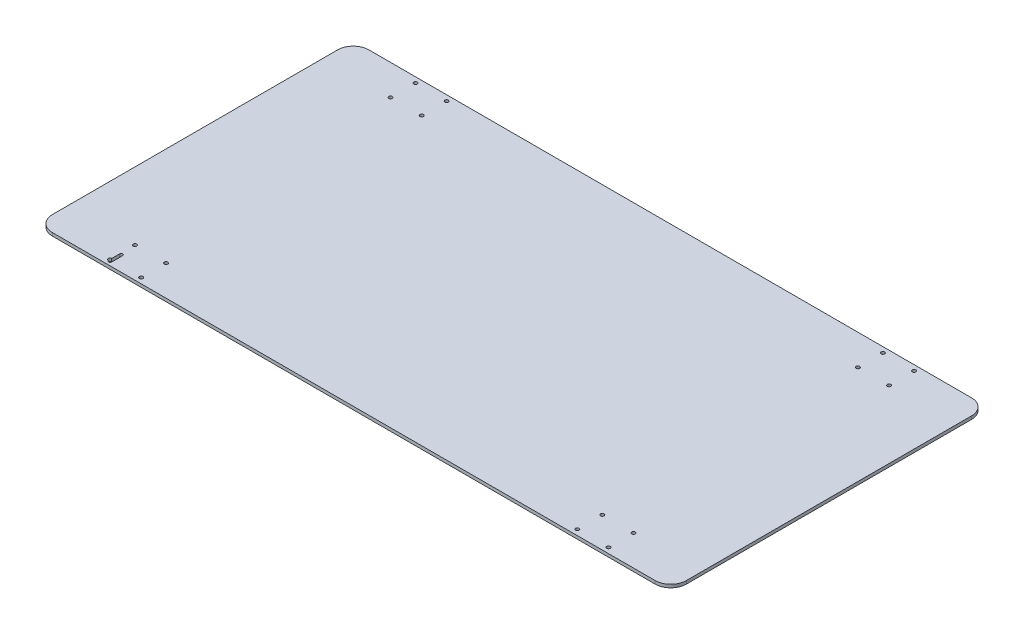
ISO-10303-21;
HEADER;
FILE_DESCRIPTION(('STEP AP214'),'2;1');
FILE_NAME('part.step','',(''),(''),'','','');
FILE_SCHEMA(('AUTOMOTIVE_DESIGN { 1 0 10303 214 1 1 1 1 }'));
ENDSEC;
DATA;
#1=APPLICATION_CONTEXT('core data for automotive mechanical design processes');
#2=APPLICATION_PROTOCOL_DEFINITION('international standard','automotive_design',2000,#1);
#3=PRODUCT_CONTEXT('',#1,'mechanical');
#4=PRODUCT('Part','Part','',(#3));
#5=PRODUCT_RELATED_PRODUCT_CATEGORY('part','',(#4));
#6=PRODUCT_DEFINITION_FORMATION('','',#4);
#7=PRODUCT_DEFINITION_CONTEXT('part definition',#1,'design');
#8=PRODUCT_DEFINITION('design','',#6,#7);
#9=PRODUCT_DEFINITION_SHAPE('','',#8);
#10=(LENGTH_UNIT() NAMED_UNIT(*) SI_UNIT(.MILLI.,.METRE.));
#11=(NAMED_UNIT(*) PLANE_ANGLE_UNIT() SI_UNIT($,.RADIAN.));
#12=(NAMED_UNIT(*) SI_UNIT($,.STERADIAN.) SOLID_ANGLE_UNIT());
#13=UNCERTAINTY_MEASURE_WITH_UNIT(LENGTH_MEASURE(1.E-05),#10,'distance_accuracy_value','');
#14=(GEOMETRIC_REPRESENTATION_CONTEXT(3) GLOBAL_UNCERTAINTY_ASSIGNED_CONTEXT((#13)) GLOBAL_UNIT_ASSIGNED_CONTEXT((#10,
#11,#12)) REPRESENTATION_CONTEXT('',''));
#15=CARTESIAN_POINT('',(0.,0.,0.));
#16=DIRECTION('',(0.,0.,1.));
#17=DIRECTION('',(1.,0.,0.));
#18=AXIS2_PLACEMENT_3D('',#15,#16,#17);
#19=CARTESIAN_POINT('',(0.,3.,0.));
#20=DIRECTION('',(0.,1.,0.));
#21=DIRECTION('',(0.,0.,1.));
#22=AXIS2_PLACEMENT_3D('',#19,#20,#21);
#23=PLANE('',#22);
#24=CARTESIAN_POINT('',(-238.,3.,148.));
#25=DIRECTION('',(0.,1.,0.));
#26=DIRECTION('',(0.,0.,1.));
#27=AXIS2_PLACEMENT_3D('',#24,#25,#26);
#28=CIRCLE('',#27,1.5);
#29=CARTESIAN_POINT('',(-239.427578245526,3.,148.460456678637));
#30=VERTEX_POINT('',#29);
#31=CARTESIAN_POINT('',(-236.5,3.,148.));
#32=VERTEX_POINT('',#31);
#33=EDGE_CURVE('E159',#30,#32,#28,.T.);
#34=ORIENTED_EDGE('',*,*,#33,.F.);
#35=CARTESIAN_POINT('',(-239.499999999848,3.,146.761999999913));
#36=DIRECTION('',(0.,1.,0.));
#37=DIRECTION('',(0.,0.,1.));
#38=AXIS2_PLACEMENT_3D('',#35,#36,#37);
#39=CIRCLE('',#38,1.70000000000001);
#40=CARTESIAN_POINT('',(-239.5,3.,145.061999999913));
#41=VERTEX_POINT('',#40);
#42=EDGE_CURVE('E220',#41,#30,#39,.T.);
#43=ORIENTED_EDGE('',*,*,#42,.F.);
#44=DIRECTION('',(0.,0.,1.));
#45=VECTOR('',#44,1.);
#46=CARTESIAN_POINT('',(-239.5,3.,137.5));
#47=LINE('',#46,#45);
#48=CARTESIAN_POINT('',(-239.5,3.,137.5));
#49=VERTEX_POINT('',#48);
#50=EDGE_CURVE('E52',#49,#41,#47,.T.);
#51=ORIENTED_EDGE('',*,*,#50,.F.);
#52=CARTESIAN_POINT('',(-238.,3.,137.5));
#53=DIRECTION('',(0.,1.,0.));
#54=DIRECTION('',(0.,0.,1.));
#55=AXIS2_PLACEMENT_3D('',#52,#53,#54);
#56=CIRCLE('',#55,1.5);
#57=CARTESIAN_POINT('',(-236.5,3.,137.5));
#58=VERTEX_POINT('',#57);
#59=EDGE_CURVE('E140',#58,#49,#56,.T.);
#60=ORIENTED_EDGE('',*,*,#59,.F.);
#61=DIRECTION('',(0.,0.,-1.));
#62=VECTOR('',#61,1.);
#63=CARTESIAN_POINT('',(-236.5,3.,137.5));
#64=LINE('',#63,#62);
#65=EDGE_CURVE('E156',#32,#58,#64,.T.);
#66=ORIENTED_EDGE('',*,*,#65,.F.);
#67=EDGE_LOOP('',(#34,#43,#51,#60,#66));
#68=FACE_BOUND('',#67,.T.);
#69=CARTESIAN_POINT('',(239.500000000579,3.,-122.76200000019));
#70=DIRECTION('',(0.,1.,0.));
#71=DIRECTION('',(0.,0.,1.));
#72=AXIS2_PLACEMENT_3D('',#69,#70,#71);
#73=CIRCLE('',#72,1.70000000000001);
#74=CARTESIAN_POINT('',(239.500000000579,3.,-121.06200000019));
#75=VERTEX_POINT('',#74);
#76=EDGE_CURVE('E178',#75,#75,#73,.T.);
#77=ORIENTED_EDGE('',*,*,#76,.F.);
#78=EDGE_LOOP('',(#77));
#79=FACE_BOUND('',#78,.T.);
#80=CARTESIAN_POINT('',(209.500000000603,3.,-146.76200000022));
#81=DIRECTION('',(0.,1.,0.));
#82=DIRECTION('',(0.,0.,1.));
#83=AXIS2_PLACEMENT_3D('',#80,#81,#82);
#84=CIRCLE('',#83,1.69999999999999);
#85=CARTESIAN_POINT('',(209.500000000603,3.,-145.06200000022));
#86=VERTEX_POINT('',#85);
#87=EDGE_CURVE('E190',#86,#86,#84,.T.);
#88=ORIENTED_EDGE('',*,*,#87,.F.);
#89=EDGE_LOOP('',(#88));
#90=FACE_BOUND('',#89,.T.);
#91=CARTESIAN_POINT('',(239.500000001198,3.,146.761999998951));
#92=DIRECTION('',(0.,1.,0.));
#93=DIRECTION('',(0.,0.,1.));
#94=AXIS2_PLACEMENT_3D('',#91,#92,#93);
#95=CIRCLE('',#94,1.70000000000001);
#96=CARTESIAN_POINT('',(239.500000001198,3.,148.461999998951));
#97=VERTEX_POINT('',#96);
#98=EDGE_CURVE('E202',#97,#97,#95,.T.);
#99=ORIENTED_EDGE('',*,*,#98,.F.);
#100=EDGE_LOOP('',(#99));
#101=FACE_BOUND('',#100,.T.);
#102=CARTESIAN_POINT('',(209.500000001078,3.,122.761999999102));
#103=DIRECTION('',(0.,1.,0.));
#104=DIRECTION('',(0.,0.,1.));
#105=AXIS2_PLACEMENT_3D('',#102,#103,#104);
#106=CIRCLE('',#105,1.69999999999998);
#107=CARTESIAN_POINT('',(209.500000001078,3.,124.461999999102));
#108=VERTEX_POINT('',#107);
#109=EDGE_CURVE('E214',#108,#108,#106,.T.);
#110=ORIENTED_EDGE('',*,*,#109,.F.);
#111=EDGE_LOOP('',(#110));
#112=FACE_BOUND('',#111,.T.);
#113=CARTESIAN_POINT('',(-209.499999999848,3.,146.761999999943));
#114=DIRECTION('',(0.,1.,0.));
#115=DIRECTION('',(0.,0.,1.));
#116=AXIS2_PLACEMENT_3D('',#113,#114,#115);
#117=CIRCLE('',#116,1.70000000000001);
#118=CARTESIAN_POINT('',(-209.499999999848,3.,148.461999999943));
#119=VERTEX_POINT('',#118);
#120=EDGE_CURVE('E225',#119,#119,#117,.T.);
#121=ORIENTED_EDGE('',*,*,#120,.F.);
#122=EDGE_LOOP('',(#121));
#123=FACE_BOUND('',#122,.T.);
#124=CARTESIAN_POINT('',(-239.499999999824,3.,122.761999999913));
#125=DIRECTION('',(0.,1.,0.));
#126=DIRECTION('',(0.,0.,1.));
#127=AXIS2_PLACEMENT_3D('',#124,#125,#126);
#128=CIRCLE('',#127,1.69999999999998);
#129=CARTESIAN_POINT('',(-239.499999999824,3.,124.461999999913));
#130=VERTEX_POINT('',#129);
#131=EDGE_CURVE('E237',#130,#130,#128,.T.);
#132=ORIENTED_EDGE('',*,*,#131,.F.);
#133=EDGE_LOOP('',(#132));
#134=FACE_BOUND('',#133,.T.);
#135=CARTESIAN_POINT('',(-209.500000000317,3.,-122.761999999378));
#136=DIRECTION('',(0.,1.,0.));
#137=DIRECTION('',(0.,0.,1.));
#138=AXIS2_PLACEMENT_3D('',#135,#136,#137);
#139=CIRCLE('',#138,1.70000000000001);
#140=CARTESIAN_POINT('',(-209.500000000317,3.,-121.061999999378));
#141=VERTEX_POINT('',#140);
#142=EDGE_CURVE('E249',#141,#141,#139,.T.);
#143=ORIENTED_EDGE('',*,*,#142,.F.);
#144=EDGE_LOOP('',(#143));
#145=FACE_BOUND('',#144,.T.);
#146=CARTESIAN_POINT('',(-239.500000000437,3.,-146.761999999228));
#147=DIRECTION('',(0.,1.,0.));
#148=DIRECTION('',(0.,0.,1.));
#149=AXIS2_PLACEMENT_3D('',#146,#147,#148);
#150=CIRCLE('',#149,1.70000000000001);
#151=CARTESIAN_POINT('',(-239.500000000437,3.,-145.061999999228));
#152=VERTEX_POINT('',#151);
#153=EDGE_CURVE('E261',#152,#152,#150,.T.);
#154=ORIENTED_EDGE('',*,*,#153,.F.);
#155=EDGE_LOOP('',(#154));
#156=FACE_BOUND('',#155,.T.);
#157=DIRECTION('',(0.,0.,1.));
#158=VECTOR('',#157,1.);
#159=CARTESIAN_POINT('',(-304.5,3.,-152.));
#160=LINE('',#159,#158);
#161=CARTESIAN_POINT('',(-304.5,3.,-137.));
#162=VERTEX_POINT('',#161);
#163=CARTESIAN_POINT('',(-304.5,3.,137.));
#164=VERTEX_POINT('',#163);
#165=EDGE_CURVE('E273',#162,#164,#160,.T.);
#166=ORIENTED_EDGE('',*,*,#165,.T.);
#167=CARTESIAN_POINT('',(-289.5,3.,137.));
#168=DIRECTION('',(0.,1.,0.));
#169=DIRECTION('',(0.,0.,1.));
#170=AXIS2_PLACEMENT_3D('',#167,#168,#169);
#171=CIRCLE('',#170,15.);
#172=CARTESIAN_POINT('',(-289.5,3.,152.));
#173=VERTEX_POINT('',#172);
#174=EDGE_CURVE('E312',#164,#173,#171,.T.);
#175=ORIENTED_EDGE('',*,*,#174,.T.);
#176=DIRECTION('',(1.,0.,0.));
#177=VECTOR('',#176,1.);
#178=CARTESIAN_POINT('',(-304.5,3.,152.));
#179=LINE('',#178,#177);
#180=CARTESIAN_POINT('',(289.5,3.,152.));
#181=VERTEX_POINT('',#180);
#182=EDGE_CURVE('E276',#173,#181,#179,.T.);
#183=ORIENTED_EDGE('',*,*,#182,.T.);
#184=CARTESIAN_POINT('',(289.5,3.,137.));
#185=DIRECTION('',(0.,1.,0.));
#186=DIRECTION('',(0.,0.,1.));
#187=AXIS2_PLACEMENT_3D('',#184,#185,#186);
#188=CIRCLE('',#187,15.);
#189=CARTESIAN_POINT('',(304.5,3.,137.));
#190=VERTEX_POINT('',#189);
#191=EDGE_CURVE('E306',#181,#190,#188,.T.);
#192=ORIENTED_EDGE('',*,*,#191,.T.);
#193=DIRECTION('',(0.,0.,-1.));
#194=VECTOR('',#193,1.);
#195=CARTESIAN_POINT('',(304.5,3.,-152.));
#196=LINE('',#195,#194);
#197=CARTESIAN_POINT('',(304.5,3.,-137.));
#198=VERTEX_POINT('',#197);
#199=EDGE_CURVE('E267',#190,#198,#196,.T.);
#200=ORIENTED_EDGE('',*,*,#199,.T.);
#201=CARTESIAN_POINT('',(289.5,3.,-137.));
#202=DIRECTION('',(0.,1.,0.));
#203=DIRECTION('',(0.,0.,1.));
#204=AXIS2_PLACEMENT_3D('',#201,#202,#203);
#205=CIRCLE('',#204,15.);
#206=CARTESIAN_POINT('',(289.5,3.,-152.));
#207=VERTEX_POINT('',#206);
#208=EDGE_CURVE('E308',#198,#207,#205,.T.);
#209=ORIENTED_EDGE('',*,*,#208,.T.);
#210=DIRECTION('',(-1.,0.,0.));
#211=VECTOR('',#210,1.);
#212=CARTESIAN_POINT('',(-304.5,3.,-152.));
#213=LINE('',#212,#211);
#214=CARTESIAN_POINT('',(-289.5,3.,-152.));
#215=VERTEX_POINT('',#214);
#216=EDGE_CURVE('E270',#207,#215,#213,.T.);
#217=ORIENTED_EDGE('',*,*,#216,.T.);
#218=CARTESIAN_POINT('',(-289.5,3.,-137.));
#219=DIRECTION('',(0.,1.,0.));
#220=DIRECTION('',(0.,0.,1.));
#221=AXIS2_PLACEMENT_3D('',#218,#219,#220);
#222=CIRCLE('',#221,15.);
#223=EDGE_CURVE('E310',#215,#162,#222,.T.);
#224=ORIENTED_EDGE('',*,*,#223,.T.);
#225=EDGE_LOOP('',(#166,#175,#183,#192,#200,#209,#217,#224));
#226=FACE_BOUND('',#225,.T.);
#227=CARTESIAN_POINT('',(-209.500000000437,3.,-146.761999999378));
#228=DIRECTION('',(0.,1.,0.));
#229=DIRECTION('',(0.,0.,1.));
#230=AXIS2_PLACEMENT_3D('',#227,#228,#229);
#231=CIRCLE('',#230,1.69999999999999);
#232=CARTESIAN_POINT('',(-209.500000000437,3.,-145.061999999378));
#233=VERTEX_POINT('',#232);
#234=EDGE_CURVE('E255',#233,#233,#231,.T.);
#235=ORIENTED_EDGE('',*,*,#234,.F.);
#236=EDGE_LOOP('',(#235));
#237=FACE_BOUND('',#236,.T.);
#238=CARTESIAN_POINT('',(-239.500000000317,3.,-122.761999999228));
#239=DIRECTION('',(0.,1.,0.));
#240=DIRECTION('',(0.,0.,1.));
#241=AXIS2_PLACEMENT_3D('',#238,#239,#240);
#242=CIRCLE('',#241,1.70000000000001);
#243=CARTESIAN_POINT('',(-239.500000000317,3.,-121.061999999228));
#244=VERTEX_POINT('',#243);
#245=EDGE_CURVE('E243',#244,#244,#242,.T.);
#246=ORIENTED_EDGE('',*,*,#245,.F.);
#247=EDGE_LOOP('',(#246));
#248=FACE_BOUND('',#247,.T.);
#249=CARTESIAN_POINT('',(-209.499999999824,3.,122.761999999943));
#250=DIRECTION('',(0.,1.,0.));
#251=DIRECTION('',(0.,0.,1.));
#252=AXIS2_PLACEMENT_3D('',#249,#250,#251);
#253=CIRCLE('',#252,1.70000000000001);
#254=CARTESIAN_POINT('',(-209.499999999824,3.,124.461999999943));
#255=VERTEX_POINT('',#254);
#256=EDGE_CURVE('E231',#255,#255,#253,.T.);
#257=ORIENTED_EDGE('',*,*,#256,.F.);
#258=EDGE_LOOP('',(#257));
#259=FACE_BOUND('',#258,.T.);
#260=CARTESIAN_POINT('',(239.500000001078,3.,122.761999998951));
#261=DIRECTION('',(0.,1.,0.));
#262=DIRECTION('',(0.,0.,1.));
#263=AXIS2_PLACEMENT_3D('',#260,#261,#262);
#264=CIRCLE('',#263,1.69999999999998);
#265=CARTESIAN_POINT('',(239.500000001078,3.,124.461999998951));
#266=VERTEX_POINT('',#265);
#267=EDGE_CURVE('E208',#266,#266,#264,.T.);
#268=ORIENTED_EDGE('',*,*,#267,.F.);
#269=EDGE_LOOP('',(#268));
#270=FACE_BOUND('',#269,.T.);
#271=CARTESIAN_POINT('',(209.500000001198,3.,146.761999999102));
#272=DIRECTION('',(0.,1.,0.));
#273=DIRECTION('',(0.,0.,1.));
#274=AXIS2_PLACEMENT_3D('',#271,#272,#273);
#275=CIRCLE('',#274,1.70000000000001);
#276=CARTESIAN_POINT('',(209.500000001198,3.,148.461999999102));
#277=VERTEX_POINT('',#276);
#278=EDGE_CURVE('E196',#277,#277,#275,.T.);
#279=ORIENTED_EDGE('',*,*,#278,.F.);
#280=EDGE_LOOP('',(#279));
#281=FACE_BOUND('',#280,.T.);
#282=CARTESIAN_POINT('',(239.500000000603,3.,-146.76200000019));
#283=DIRECTION('',(0.,1.,0.));
#284=DIRECTION('',(0.,0.,1.));
#285=AXIS2_PLACEMENT_3D('',#282,#283,#284);
#286=CIRCLE('',#285,1.69999999999999);
#287=CARTESIAN_POINT('',(239.500000000603,3.,-145.06200000019));
#288=VERTEX_POINT('',#287);
#289=EDGE_CURVE('E184',#288,#288,#286,.T.);
#290=ORIENTED_EDGE('',*,*,#289,.F.);
#291=EDGE_LOOP('',(#290));
#292=FACE_BOUND('',#291,.T.);
#293=CARTESIAN_POINT('',(209.500000000579,3.,-122.76200000022));
#294=DIRECTION('',(0.,1.,0.));
#295=DIRECTION('',(0.,0.,1.));
#296=AXIS2_PLACEMENT_3D('',#293,#294,#295);
#297=CIRCLE('',#296,1.70000000000001);
#298=CARTESIAN_POINT('',(209.500000000579,3.,-121.06200000022));
#299=VERTEX_POINT('',#298);
#300=EDGE_CURVE('E172',#299,#299,#297,.T.);
#301=ORIENTED_EDGE('',*,*,#300,.F.);
#302=EDGE_LOOP('',(#301));
#303=FACE_BOUND('',#302,.T.);
#304=ADVANCED_FACE('F37',(#68,#79,#90,#101,#112,#123,#134,#145,#156,#226,#237,#248,#259,#270,
#281,#292,#303),#23,.T.);
#305=CARTESIAN_POINT('',(0.,0.,0.));
#306=DIRECTION('',(0.,1.,0.));
#307=DIRECTION('',(0.,0.,1.));
#308=AXIS2_PLACEMENT_3D('',#305,#306,#307);
#309=PLANE('',#308);
#310=DIRECTION('',(1.,0.,0.));
#311=VECTOR('',#310,1.);
#312=CARTESIAN_POINT('',(-304.5,0.,152.));
#313=LINE('',#312,#311);
#314=CARTESIAN_POINT('',(-289.5,0.,152.));
#315=VERTEX_POINT('',#314);
#316=CARTESIAN_POINT('',(289.5,0.,152.));
#317=VERTEX_POINT('',#316);
#318=EDGE_CURVE('E271',#315,#317,#313,.T.);
#319=ORIENTED_EDGE('',*,*,#318,.F.);
#320=CARTESIAN_POINT('',(-289.5,0.,137.));
#321=DIRECTION('',(0.,1.,0.));
#322=DIRECTION('',(0.,0.,1.));
#323=AXIS2_PLACEMENT_3D('',#320,#321,#322);
#324=CIRCLE('',#323,15.);
#325=CARTESIAN_POINT('',(-304.5,0.,137.));
#326=VERTEX_POINT('',#325);
#327=EDGE_CURVE('E299',#315,#326,#324,.F.);
#328=ORIENTED_EDGE('',*,*,#327,.T.);
#329=DIRECTION('',(0.,0.,1.));
#330=VECTOR('',#329,1.);
#331=CARTESIAN_POINT('',(-304.5,0.,-152.));
#332=LINE('',#331,#330);
#333=CARTESIAN_POINT('',(-304.5,0.,-137.));
#334=VERTEX_POINT('',#333);
#335=EDGE_CURVE('E284',#334,#326,#332,.T.);
#336=ORIENTED_EDGE('',*,*,#335,.F.);
#337=CARTESIAN_POINT('',(-289.5,0.,-137.));
#338=DIRECTION('',(0.,1.,0.));
#339=DIRECTION('',(0.,0.,1.));
#340=AXIS2_PLACEMENT_3D('',#337,#338,#339);
#341=CIRCLE('',#340,15.);
#342=CARTESIAN_POINT('',(-289.5,0.,-152.));
#343=VERTEX_POINT('',#342);
#344=EDGE_CURVE('E297',#334,#343,#341,.F.);
#345=ORIENTED_EDGE('',*,*,#344,.T.);
#346=DIRECTION('',(-1.,0.,0.));
#347=VECTOR('',#346,1.);
#348=CARTESIAN_POINT('',(-304.5,0.,-152.));
#349=LINE('',#348,#347);
#350=CARTESIAN_POINT('',(289.5,0.,-152.));
#351=VERTEX_POINT('',#350);
#352=EDGE_CURVE('E282',#351,#343,#349,.T.);
#353=ORIENTED_EDGE('',*,*,#352,.F.);
#354=CARTESIAN_POINT('',(289.5,0.,-137.));
#355=DIRECTION('',(0.,1.,0.));
#356=DIRECTION('',(0.,0.,1.));
#357=AXIS2_PLACEMENT_3D('',#354,#355,#356);
#358=CIRCLE('',#357,15.);
#359=CARTESIAN_POINT('',(304.5,0.,-137.));
#360=VERTEX_POINT('',#359);
#361=EDGE_CURVE('E295',#351,#360,#358,.F.);
#362=ORIENTED_EDGE('',*,*,#361,.T.);
#363=DIRECTION('',(0.,0.,-1.));
#364=VECTOR('',#363,1.);
#365=CARTESIAN_POINT('',(304.5,0.,-152.));
#366=LINE('',#365,#364);
#367=CARTESIAN_POINT('',(304.5,0.,137.));
#368=VERTEX_POINT('',#367);
#369=EDGE_CURVE('E264',#368,#360,#366,.T.);
#370=ORIENTED_EDGE('',*,*,#369,.F.);
#371=CARTESIAN_POINT('',(289.5,0.,137.));
#372=DIRECTION('',(0.,1.,0.));
#373=DIRECTION('',(0.,0.,1.));
#374=AXIS2_PLACEMENT_3D('',#371,#372,#373);
#375=CIRCLE('',#374,15.);
#376=EDGE_CURVE('E293',#368,#317,#375,.F.);
#377=ORIENTED_EDGE('',*,*,#376,.T.);
#378=EDGE_LOOP('',(#319,#328,#336,#345,#353,#362,#370,#377));
#379=FACE_BOUND('',#378,.T.);
#380=CARTESIAN_POINT('',(-239.500000000437,0.,-146.761999999228));
#381=DIRECTION('',(0.,1.,0.));
#382=DIRECTION('',(0.,0.,1.));
#383=AXIS2_PLACEMENT_3D('',#380,#381,#382);
#384=CIRCLE('',#383,1.70000000000001);
#385=CARTESIAN_POINT('',(-239.500000000437,0.,-145.061999999228));
#386=VERTEX_POINT('',#385);
#387=EDGE_CURVE('E258',#386,#386,#384,.T.);
#388=ORIENTED_EDGE('',*,*,#387,.T.);
#389=EDGE_LOOP('',(#388));
#390=FACE_BOUND('',#389,.T.);
#391=CARTESIAN_POINT('',(-209.500000000437,0.,-146.761999999378));
#392=DIRECTION('',(0.,1.,0.));
#393=DIRECTION('',(0.,0.,1.));
#394=AXIS2_PLACEMENT_3D('',#391,#392,#393);
#395=CIRCLE('',#394,1.69999999999999);
#396=CARTESIAN_POINT('',(-209.500000000437,0.,-145.061999999378));
#397=VERTEX_POINT('',#396);
#398=EDGE_CURVE('E252',#397,#397,#395,.T.);
#399=ORIENTED_EDGE('',*,*,#398,.T.);
#400=EDGE_LOOP('',(#399));
#401=FACE_BOUND('',#400,.T.);
#402=CARTESIAN_POINT('',(-209.500000000317,0.,-122.761999999378));
#403=DIRECTION('',(0.,1.,0.));
#404=DIRECTION('',(0.,0.,1.));
#405=AXIS2_PLACEMENT_3D('',#402,#403,#404);
#406=CIRCLE('',#405,1.70000000000001);
#407=CARTESIAN_POINT('',(-209.500000000317,0.,-121.061999999378));
#408=VERTEX_POINT('',#407);
#409=EDGE_CURVE('E246',#408,#408,#406,.T.);
#410=ORIENTED_EDGE('',*,*,#409,.T.);
#411=EDGE_LOOP('',(#410));
#412=FACE_BOUND('',#411,.T.);
#413=CARTESIAN_POINT('',(-239.500000000317,0.,-122.761999999228));
#414=DIRECTION('',(0.,1.,0.));
#415=DIRECTION('',(0.,0.,1.));
#416=AXIS2_PLACEMENT_3D('',#413,#414,#415);
#417=CIRCLE('',#416,1.70000000000001);
#418=CARTESIAN_POINT('',(-239.500000000317,0.,-121.061999999228));
#419=VERTEX_POINT('',#418);
#420=EDGE_CURVE('E240',#419,#419,#417,.T.);
#421=ORIENTED_EDGE('',*,*,#420,.T.);
#422=EDGE_LOOP('',(#421));
#423=FACE_BOUND('',#422,.T.);
#424=CARTESIAN_POINT('',(-239.499999999824,0.,122.761999999913));
#425=DIRECTION('',(0.,1.,0.));
#426=DIRECTION('',(0.,0.,1.));
#427=AXIS2_PLACEMENT_3D('',#424,#425,#426);
#428=CIRCLE('',#427,1.69999999999998);
#429=CARTESIAN_POINT('',(-239.499999999824,0.,124.461999999913));
#430=VERTEX_POINT('',#429);
#431=EDGE_CURVE('E234',#430,#430,#428,.T.);
#432=ORIENTED_EDGE('',*,*,#431,.T.);
#433=EDGE_LOOP('',(#432));
#434=FACE_BOUND('',#433,.T.);
#435=CARTESIAN_POINT('',(-209.499999999824,0.,122.761999999943));
#436=DIRECTION('',(0.,1.,0.));
#437=DIRECTION('',(0.,0.,1.));
#438=AXIS2_PLACEMENT_3D('',#435,#436,#437);
#439=CIRCLE('',#438,1.70000000000001);
#440=CARTESIAN_POINT('',(-209.499999999824,0.,124.461999999943));
#441=VERTEX_POINT('',#440);
#442=EDGE_CURVE('E228',#441,#441,#439,.T.);
#443=ORIENTED_EDGE('',*,*,#442,.T.);
#444=EDGE_LOOP('',(#443));
#445=FACE_BOUND('',#444,.T.);
#446=CARTESIAN_POINT('',(-209.499999999848,0.,146.761999999943));
#447=DIRECTION('',(0.,1.,0.));
#448=DIRECTION('',(0.,0.,1.));
#449=AXIS2_PLACEMENT_3D('',#446,#447,#448);
#450=CIRCLE('',#449,1.70000000000001);
#451=CARTESIAN_POINT('',(-209.499999999848,0.,148.461999999943));
#452=VERTEX_POINT('',#451);
#453=EDGE_CURVE('E223',#452,#452,#450,.T.);
#454=ORIENTED_EDGE('',*,*,#453,.T.);
#455=EDGE_LOOP('',(#454));
#456=FACE_BOUND('',#455,.T.);
#457=CARTESIAN_POINT('',(-239.499999999848,0.,146.761999999913));
#458=DIRECTION('',(0.,1.,0.));
#459=DIRECTION('',(0.,0.,1.));
#460=AXIS2_PLACEMENT_3D('',#457,#458,#459);
#461=CIRCLE('',#460,1.70000000000001);
#462=CARTESIAN_POINT('',(-239.5,0.,145.061999999913));
#463=VERTEX_POINT('',#462);
#464=CARTESIAN_POINT('',(-239.427578245526,0.,148.460456678637));
#465=VERTEX_POINT('',#464);
#466=EDGE_CURVE('E217',#463,#465,#461,.T.);
#467=ORIENTED_EDGE('',*,*,#466,.T.);
#468=CARTESIAN_POINT('',(-238.,0.,148.));
#469=DIRECTION('',(0.,1.,0.));
#470=DIRECTION('',(0.,0.,1.));
#471=AXIS2_PLACEMENT_3D('',#468,#469,#470);
#472=CIRCLE('',#471,1.5);
#473=CARTESIAN_POINT('',(-236.5,0.,148.));
#474=VERTEX_POINT('',#473);
#475=EDGE_CURVE('E150',#465,#474,#472,.T.);
#476=ORIENTED_EDGE('',*,*,#475,.T.);
#477=DIRECTION('',(0.,0.,-1.));
#478=VECTOR('',#477,1.);
#479=CARTESIAN_POINT('',(-236.5,0.,137.5));
#480=LINE('',#479,#478);
#481=CARTESIAN_POINT('',(-236.5,0.,137.5));
#482=VERTEX_POINT('',#481);
#483=EDGE_CURVE('E142',#474,#482,#480,.T.);
#484=ORIENTED_EDGE('',*,*,#483,.T.);
#485=CARTESIAN_POINT('',(-238.,0.,137.5));
#486=DIRECTION('',(0.,1.,0.));
#487=DIRECTION('',(0.,0.,1.));
#488=AXIS2_PLACEMENT_3D('',#485,#486,#487);
#489=CIRCLE('',#488,1.5);
#490=CARTESIAN_POINT('',(-239.5,0.,137.5));
#491=VERTEX_POINT('',#490);
#492=EDGE_CURVE('E137',#482,#491,#489,.T.);
#493=ORIENTED_EDGE('',*,*,#492,.T.);
#494=DIRECTION('',(0.,0.,1.));
#495=VECTOR('',#494,1.);
#496=CARTESIAN_POINT('',(-239.5,0.,137.5));
#497=LINE('',#496,#495);
#498=EDGE_CURVE('E145',#491,#463,#497,.T.);
#499=ORIENTED_EDGE('',*,*,#498,.T.);
#500=EDGE_LOOP('',(#467,#476,#484,#493,#499));
#501=FACE_BOUND('',#500,.T.);
#502=CARTESIAN_POINT('',(209.500000001078,0.,122.761999999102));
#503=DIRECTION('',(0.,1.,0.));
#504=DIRECTION('',(0.,0.,1.));
#505=AXIS2_PLACEMENT_3D('',#502,#503,#504);
#506=CIRCLE('',#505,1.69999999999998);
#507=CARTESIAN_POINT('',(209.500000001078,0.,124.461999999102));
#508=VERTEX_POINT('',#507);
#509=EDGE_CURVE('E211',#508,#508,#506,.T.);
#510=ORIENTED_EDGE('',*,*,#509,.T.);
#511=EDGE_LOOP('',(#510));
#512=FACE_BOUND('',#511,.T.);
#513=CARTESIAN_POINT('',(239.500000001078,0.,122.761999998951));
#514=DIRECTION('',(0.,1.,0.));
#515=DIRECTION('',(0.,0.,1.));
#516=AXIS2_PLACEMENT_3D('',#513,#514,#515);
#517=CIRCLE('',#516,1.69999999999998);
#518=CARTESIAN_POINT('',(239.500000001078,0.,124.461999998951));
#519=VERTEX_POINT('',#518);
#520=EDGE_CURVE('E205',#519,#519,#517,.T.);
#521=ORIENTED_EDGE('',*,*,#520,.T.);
#522=EDGE_LOOP('',(#521));
#523=FACE_BOUND('',#522,.T.);
#524=CARTESIAN_POINT('',(239.500000001198,0.,146.761999998951));
#525=DIRECTION('',(0.,1.,0.));
#526=DIRECTION('',(0.,0.,1.));
#527=AXIS2_PLACEMENT_3D('',#524,#525,#526);
#528=CIRCLE('',#527,1.70000000000001);
#529=CARTESIAN_POINT('',(239.500000001198,0.,148.461999998951));
#530=VERTEX_POINT('',#529);
#531=EDGE_CURVE('E199',#530,#530,#528,.T.);
#532=ORIENTED_EDGE('',*,*,#531,.T.);
#533=EDGE_LOOP('',(#532));
#534=FACE_BOUND('',#533,.T.);
#535=CARTESIAN_POINT('',(209.500000001198,0.,146.761999999102));
#536=DIRECTION('',(0.,1.,0.));
#537=DIRECTION('',(0.,0.,1.));
#538=AXIS2_PLACEMENT_3D('',#535,#536,#537);
#539=CIRCLE('',#538,1.70000000000001);
#540=CARTESIAN_POINT('',(209.500000001198,0.,148.461999999102));
#541=VERTEX_POINT('',#540);
#542=EDGE_CURVE('E193',#541,#541,#539,.T.);
#543=ORIENTED_EDGE('',*,*,#542,.T.);
#544=EDGE_LOOP('',(#543));
#545=FACE_BOUND('',#544,.T.);
#546=CARTESIAN_POINT('',(209.500000000603,0.,-146.76200000022));
#547=DIRECTION('',(0.,1.,0.));
#548=DIRECTION('',(0.,0.,1.));
#549=AXIS2_PLACEMENT_3D('',#546,#547,#548);
#550=CIRCLE('',#549,1.69999999999999);
#551=CARTESIAN_POINT('',(209.500000000603,0.,-145.06200000022));
#552=VERTEX_POINT('',#551);
#553=EDGE_CURVE('E187',#552,#552,#550,.T.);
#554=ORIENTED_EDGE('',*,*,#553,.T.);
#555=EDGE_LOOP('',(#554));
#556=FACE_BOUND('',#555,.T.);
#557=CARTESIAN_POINT('',(239.500000000603,0.,-146.76200000019));
#558=DIRECTION('',(0.,1.,0.));
#559=DIRECTION('',(0.,0.,1.));
#560=AXIS2_PLACEMENT_3D('',#557,#558,#559);
#561=CIRCLE('',#560,1.69999999999999);
#562=CARTESIAN_POINT('',(239.500000000603,0.,-145.06200000019));
#563=VERTEX_POINT('',#562);
#564=EDGE_CURVE('E181',#563,#563,#561,.T.);
#565=ORIENTED_EDGE('',*,*,#564,.T.);
#566=EDGE_LOOP('',(#565));
#567=FACE_BOUND('',#566,.T.);
#568=CARTESIAN_POINT('',(239.500000000579,0.,-122.76200000019));
#569=DIRECTION('',(0.,1.,0.));
#570=DIRECTION('',(0.,0.,1.));
#571=AXIS2_PLACEMENT_3D('',#568,#569,#570);
#572=CIRCLE('',#571,1.70000000000001);
#573=CARTESIAN_POINT('',(239.500000000579,0.,-121.06200000019));
#574=VERTEX_POINT('',#573);
#575=EDGE_CURVE('E175',#574,#574,#572,.T.);
#576=ORIENTED_EDGE('',*,*,#575,.T.);
#577=EDGE_LOOP('',(#576));
#578=FACE_BOUND('',#577,.T.);
#579=CARTESIAN_POINT('',(209.500000000579,0.,-122.76200000022));
#580=DIRECTION('',(0.,1.,0.));
#581=DIRECTION('',(0.,0.,1.));
#582=AXIS2_PLACEMENT_3D('',#579,#580,#581);
#583=CIRCLE('',#582,1.70000000000001);
#584=CARTESIAN_POINT('',(209.500000000579,0.,-121.06200000022));
#585=VERTEX_POINT('',#584);
#586=EDGE_CURVE('E169',#585,#585,#583,.T.);
#587=ORIENTED_EDGE('',*,*,#586,.T.);
#588=EDGE_LOOP('',(#587));
#589=FACE_BOUND('',#588,.T.);
#590=ADVANCED_FACE('F152',(#379,#390,#401,#412,#423,#434,#445,#456,#501,#512,#523,#534,#545,
#556,#567,#578,#589),#309,.F.);
#591=CARTESIAN_POINT('',(304.5,3.,-152.));
#592=DIRECTION('',(-1.,0.,0.));
#593=DIRECTION('',(0.,0.,1.));
#594=AXIS2_PLACEMENT_3D('',#591,#592,#593);
#595=PLANE('',#594);
#596=ORIENTED_EDGE('',*,*,#369,.T.);
#597=DIRECTION('',(0.,-1.,0.));
#598=VECTOR('',#597,1.);
#599=CARTESIAN_POINT('',(304.5,3.,-137.));
#600=LINE('',#599,#598);
#601=EDGE_CURVE('E321',#360,#198,#600,.F.);
#602=ORIENTED_EDGE('',*,*,#601,.T.);
#603=ORIENTED_EDGE('',*,*,#199,.F.);
#604=DIRECTION('',(0.,-1.,0.));
#605=VECTOR('',#604,1.);
#606=CARTESIAN_POINT('',(304.5,3.,137.));
#607=LINE('',#606,#605);
#608=EDGE_CURVE('E318',#190,#368,#607,.T.);
#609=ORIENTED_EDGE('',*,*,#608,.T.);
#610=EDGE_LOOP('',(#596,#602,#603,#609));
#611=FACE_BOUND('',#610,.T.);
#612=ADVANCED_FACE('F325',(#611),#595,.F.);
#613=CARTESIAN_POINT('',(-304.5,3.,-152.));
#614=DIRECTION('',(0.,0.,1.));
#615=DIRECTION('',(1.,0.,0.));
#616=AXIS2_PLACEMENT_3D('',#613,#614,#615);
#617=PLANE('',#616);
#618=ORIENTED_EDGE('',*,*,#352,.T.);
#619=DIRECTION('',(0.,-1.,0.));
#620=VECTOR('',#619,1.);
#621=CARTESIAN_POINT('',(-289.5,3.,-152.));
#622=LINE('',#621,#620);
#623=EDGE_CURVE('E60',#343,#215,#622,.F.);
#624=ORIENTED_EDGE('',*,*,#623,.T.);
#625=ORIENTED_EDGE('',*,*,#216,.F.);
#626=DIRECTION('',(0.,-1.,0.));
#627=VECTOR('',#626,1.);
#628=CARTESIAN_POINT('',(289.5,3.,-152.));
#629=LINE('',#628,#627);
#630=EDGE_CURVE('E314',#207,#351,#629,.T.);
#631=ORIENTED_EDGE('',*,*,#630,.T.);
#632=EDGE_LOOP('',(#618,#624,#625,#631));
#633=FACE_BOUND('',#632,.T.);
#634=ADVANCED_FACE('F336',(#633),#617,.F.);
#635=CARTESIAN_POINT('',(-304.5,3.,-152.));
#636=DIRECTION('',(1.,0.,0.));
#637=DIRECTION('',(0.,0.,-1.));
#638=AXIS2_PLACEMENT_3D('',#635,#636,#637);
#639=PLANE('',#638);
#640=ORIENTED_EDGE('',*,*,#335,.T.);
#641=DIRECTION('',(0.,-1.,0.));
#642=VECTOR('',#641,1.);
#643=CARTESIAN_POINT('',(-304.5,3.,137.));
#644=LINE('',#643,#642);
#645=EDGE_CURVE('E304',#326,#164,#644,.F.);
#646=ORIENTED_EDGE('',*,*,#645,.T.);
#647=ORIENTED_EDGE('',*,*,#165,.F.);
#648=DIRECTION('',(0.,-1.,0.));
#649=VECTOR('',#648,1.);
#650=CARTESIAN_POINT('',(-304.5,3.,-137.));
#651=LINE('',#650,#649);
#652=EDGE_CURVE('E301',#162,#334,#651,.T.);
#653=ORIENTED_EDGE('',*,*,#652,.T.);
#654=EDGE_LOOP('',(#640,#646,#647,#653));
#655=FACE_BOUND('',#654,.T.);
#656=ADVANCED_FACE('F347',(#655),#639,.F.);
#657=CARTESIAN_POINT('',(-304.5,3.,152.));
#658=DIRECTION('',(0.,0.,-1.));
#659=DIRECTION('',(-1.,0.,0.));
#660=AXIS2_PLACEMENT_3D('',#657,#658,#659);
#661=PLANE('',#660);
#662=ORIENTED_EDGE('',*,*,#182,.F.);
#663=DIRECTION('',(0.,-1.,0.));
#664=VECTOR('',#663,1.);
#665=CARTESIAN_POINT('',(-289.5,3.,152.));
#666=LINE('',#665,#664);
#667=EDGE_CURVE('E290',#173,#315,#666,.T.);
#668=ORIENTED_EDGE('',*,*,#667,.T.);
#669=ORIENTED_EDGE('',*,*,#318,.T.);
#670=DIRECTION('',(0.,-1.,0.));
#671=VECTOR('',#670,1.);
#672=CARTESIAN_POINT('',(289.5,3.,152.));
#673=LINE('',#672,#671);
#674=EDGE_CURVE('E279',#317,#181,#673,.F.);
#675=ORIENTED_EDGE('',*,*,#674,.T.);
#676=EDGE_LOOP('',(#662,#668,#669,#675));
#677=FACE_BOUND('',#676,.T.);
#678=ADVANCED_FACE('F355',(#677),#661,.F.);
#679=CARTESIAN_POINT('',(-239.500000000437,3.,-146.761999999228));
#680=DIRECTION('',(0.,-1.,0.));
#681=DIRECTION('',(0.,0.,-1.));
#682=AXIS2_PLACEMENT_3D('',#679,#680,#681);
#683=CYLINDRICAL_SURFACE('',#682,1.70000000000001);
#684=ORIENTED_EDGE('',*,*,#153,.T.);
#685=EDGE_LOOP('',(#684));
#686=FACE_BOUND('',#685,.T.);
#687=ORIENTED_EDGE('',*,*,#387,.F.);
#688=EDGE_LOOP('',(#687));
#689=FACE_BOUND('',#688,.T.);
#690=ADVANCED_FACE('F375',(#686,#689),#683,.F.);
#691=CARTESIAN_POINT('',(-209.500000000437,3.,-146.761999999378));
#692=DIRECTION('',(0.,-1.,0.));
#693=DIRECTION('',(0.,0.,-1.));
#694=AXIS2_PLACEMENT_3D('',#691,#692,#693);
#695=CYLINDRICAL_SURFACE('',#694,1.69999999999999);
#696=ORIENTED_EDGE('',*,*,#234,.T.);
#697=EDGE_LOOP('',(#696));
#698=FACE_BOUND('',#697,.T.);
#699=ORIENTED_EDGE('',*,*,#398,.F.);
#700=EDGE_LOOP('',(#699));
#701=FACE_BOUND('',#700,.T.);
#702=ADVANCED_FACE('F610',(#698,#701),#695,.F.);
#703=CARTESIAN_POINT('',(-209.500000000317,3.,-122.761999999378));
#704=DIRECTION('',(0.,-1.,0.));
#705=DIRECTION('',(0.,0.,-1.));
#706=AXIS2_PLACEMENT_3D('',#703,#704,#705);
#707=CYLINDRICAL_SURFACE('',#706,1.70000000000001);
#708=ORIENTED_EDGE('',*,*,#142,.T.);
#709=EDGE_LOOP('',(#708));
#710=FACE_BOUND('',#709,.T.);
#711=ORIENTED_EDGE('',*,*,#409,.F.);
#712=EDGE_LOOP('',(#711));
#713=FACE_BOUND('',#712,.T.);
#714=ADVANCED_FACE('F600',(#710,#713),#707,.F.);
#715=CARTESIAN_POINT('',(-239.500000000317,3.,-122.761999999228));
#716=DIRECTION('',(0.,-1.,0.));
#717=DIRECTION('',(0.,0.,-1.));
#718=AXIS2_PLACEMENT_3D('',#715,#716,#717);
#719=CYLINDRICAL_SURFACE('',#718,1.70000000000001);
#720=ORIENTED_EDGE('',*,*,#245,.T.);
#721=EDGE_LOOP('',(#720));
#722=FACE_BOUND('',#721,.T.);
#723=ORIENTED_EDGE('',*,*,#420,.F.);
#724=EDGE_LOOP('',(#723));
#725=FACE_BOUND('',#724,.T.);
#726=ADVANCED_FACE('F590',(#722,#725),#719,.F.);
#727=CARTESIAN_POINT('',(-239.499999999824,3.,122.761999999913));
#728=DIRECTION('',(0.,-1.,0.));
#729=DIRECTION('',(0.,0.,-1.));
#730=AXIS2_PLACEMENT_3D('',#727,#728,#729);
#731=CYLINDRICAL_SURFACE('',#730,1.69999999999998);
#732=ORIENTED_EDGE('',*,*,#131,.T.);
#733=EDGE_LOOP('',(#732));
#734=FACE_BOUND('',#733,.T.);
#735=ORIENTED_EDGE('',*,*,#431,.F.);
#736=EDGE_LOOP('',(#735));
#737=FACE_BOUND('',#736,.T.);
#738=ADVANCED_FACE('F580',(#734,#737),#731,.F.);
#739=CARTESIAN_POINT('',(-209.499999999824,3.,122.761999999943));
#740=DIRECTION('',(0.,-1.,0.));
#741=DIRECTION('',(0.,0.,-1.));
#742=AXIS2_PLACEMENT_3D('',#739,#740,#741);
#743=CYLINDRICAL_SURFACE('',#742,1.70000000000001);
#744=ORIENTED_EDGE('',*,*,#256,.T.);
#745=EDGE_LOOP('',(#744));
#746=FACE_BOUND('',#745,.T.);
#747=ORIENTED_EDGE('',*,*,#442,.F.);
#748=EDGE_LOOP('',(#747));
#749=FACE_BOUND('',#748,.T.);
#750=ADVANCED_FACE('F570',(#746,#749),#743,.F.);
#751=CARTESIAN_POINT('',(-209.499999999848,3.,146.761999999943));
#752=DIRECTION('',(0.,-1.,0.));
#753=DIRECTION('',(0.,0.,-1.));
#754=AXIS2_PLACEMENT_3D('',#751,#752,#753);
#755=CYLINDRICAL_SURFACE('',#754,1.70000000000001);
#756=ORIENTED_EDGE('',*,*,#120,.T.);
#757=EDGE_LOOP('',(#756));
#758=FACE_BOUND('',#757,.T.);
#759=ORIENTED_EDGE('',*,*,#453,.F.);
#760=EDGE_LOOP('',(#759));
#761=FACE_BOUND('',#760,.T.);
#762=ADVANCED_FACE('F430',(#758,#761),#755,.F.);
#763=CARTESIAN_POINT('',(-239.499999999848,3.,146.761999999913));
#764=DIRECTION('',(0.,-1.,0.));
#765=DIRECTION('',(0.,0.,-1.));
#766=AXIS2_PLACEMENT_3D('',#763,#764,#765);
#767=CYLINDRICAL_SURFACE('',#766,1.70000000000001);
#768=DIRECTION('',(0.,1.,0.));
#769=VECTOR('',#768,1.);
#770=CARTESIAN_POINT('',(-239.427578245526,1.5,148.460456678637));
#771=LINE('',#770,#769);
#772=EDGE_CURVE('E11',#465,#30,#771,.T.);
#773=ORIENTED_EDGE('',*,*,#772,.F.);
#774=ORIENTED_EDGE('',*,*,#466,.F.);
#775=DIRECTION('',(0.,-1.,0.));
#776=VECTOR('',#775,1.);
#777=CARTESIAN_POINT('',(-239.5,3.,145.061999999913));
#778=LINE('',#777,#776);
#779=EDGE_CURVE('E45',#41,#463,#778,.T.);
#780=ORIENTED_EDGE('',*,*,#779,.F.);
#781=ORIENTED_EDGE('',*,*,#42,.T.);
#782=EDGE_LOOP('',(#773,#774,#780,#781));
#783=FACE_BOUND('',#782,.T.);
#784=ADVANCED_FACE('F424',(#783),#767,.F.);
#785=CARTESIAN_POINT('',(209.500000001078,3.,122.761999999102));
#786=DIRECTION('',(0.,-1.,0.));
#787=DIRECTION('',(0.,0.,-1.));
#788=AXIS2_PLACEMENT_3D('',#785,#786,#787);
#789=CYLINDRICAL_SURFACE('',#788,1.69999999999998);
#790=ORIENTED_EDGE('',*,*,#109,.T.);
#791=EDGE_LOOP('',(#790));
#792=FACE_BOUND('',#791,.T.);
#793=ORIENTED_EDGE('',*,*,#509,.F.);
#794=EDGE_LOOP('',(#793));
#795=FACE_BOUND('',#794,.T.);
#796=ADVANCED_FACE('F429',(#792,#795),#789,.F.);
#797=CARTESIAN_POINT('',(239.500000001078,3.,122.761999998951));
#798=DIRECTION('',(0.,-1.,0.));
#799=DIRECTION('',(0.,0.,-1.));
#800=AXIS2_PLACEMENT_3D('',#797,#798,#799);
#801=CYLINDRICAL_SURFACE('',#800,1.69999999999998);
#802=ORIENTED_EDGE('',*,*,#267,.T.);
#803=EDGE_LOOP('',(#802));
#804=FACE_BOUND('',#803,.T.);
#805=ORIENTED_EDGE('',*,*,#520,.F.);
#806=EDGE_LOOP('',(#805));
#807=FACE_BOUND('',#806,.T.);
#808=ADVANCED_FACE('F545',(#804,#807),#801,.F.);
#809=CARTESIAN_POINT('',(239.500000001198,3.,146.761999998951));
#810=DIRECTION('',(0.,-1.,0.));
#811=DIRECTION('',(0.,0.,-1.));
#812=AXIS2_PLACEMENT_3D('',#809,#810,#811);
#813=CYLINDRICAL_SURFACE('',#812,1.70000000000001);
#814=ORIENTED_EDGE('',*,*,#98,.T.);
#815=EDGE_LOOP('',(#814));
#816=FACE_BOUND('',#815,.T.);
#817=ORIENTED_EDGE('',*,*,#531,.F.);
#818=EDGE_LOOP('',(#817));
#819=FACE_BOUND('',#818,.T.);
#820=ADVANCED_FACE('F535',(#816,#819),#813,.F.);
#821=CARTESIAN_POINT('',(209.500000001198,3.,146.761999999102));
#822=DIRECTION('',(0.,-1.,0.));
#823=DIRECTION('',(0.,0.,-1.));
#824=AXIS2_PLACEMENT_3D('',#821,#822,#823);
#825=CYLINDRICAL_SURFACE('',#824,1.70000000000001);
#826=ORIENTED_EDGE('',*,*,#278,.T.);
#827=EDGE_LOOP('',(#826));
#828=FACE_BOUND('',#827,.T.);
#829=ORIENTED_EDGE('',*,*,#542,.F.);
#830=EDGE_LOOP('',(#829));
#831=FACE_BOUND('',#830,.T.);
#832=ADVANCED_FACE('F525',(#828,#831),#825,.F.);
#833=CARTESIAN_POINT('',(209.500000000603,3.,-146.76200000022));
#834=DIRECTION('',(0.,-1.,0.));
#835=DIRECTION('',(0.,0.,-1.));
#836=AXIS2_PLACEMENT_3D('',#833,#834,#835);
#837=CYLINDRICAL_SURFACE('',#836,1.69999999999999);
#838=ORIENTED_EDGE('',*,*,#87,.T.);
#839=EDGE_LOOP('',(#838));
#840=FACE_BOUND('',#839,.T.);
#841=ORIENTED_EDGE('',*,*,#553,.F.);
#842=EDGE_LOOP('',(#841));
#843=FACE_BOUND('',#842,.T.);
#844=ADVANCED_FACE('F515',(#840,#843),#837,.F.);
#845=CARTESIAN_POINT('',(239.500000000603,3.,-146.76200000019));
#846=DIRECTION('',(0.,-1.,0.));
#847=DIRECTION('',(0.,0.,-1.));
#848=AXIS2_PLACEMENT_3D('',#845,#846,#847);
#849=CYLINDRICAL_SURFACE('',#848,1.69999999999999);
#850=ORIENTED_EDGE('',*,*,#289,.T.);
#851=EDGE_LOOP('',(#850));
#852=FACE_BOUND('',#851,.T.);
#853=ORIENTED_EDGE('',*,*,#564,.F.);
#854=EDGE_LOOP('',(#853));
#855=FACE_BOUND('',#854,.T.);
#856=ADVANCED_FACE('F505',(#852,#855),#849,.F.);
#857=CARTESIAN_POINT('',(239.500000000579,3.,-122.76200000019));
#858=DIRECTION('',(0.,-1.,0.));
#859=DIRECTION('',(0.,0.,-1.));
#860=AXIS2_PLACEMENT_3D('',#857,#858,#859);
#861=CYLINDRICAL_SURFACE('',#860,1.70000000000001);
#862=ORIENTED_EDGE('',*,*,#76,.T.);
#863=EDGE_LOOP('',(#862));
#864=FACE_BOUND('',#863,.T.);
#865=ORIENTED_EDGE('',*,*,#575,.F.);
#866=EDGE_LOOP('',(#865));
#867=FACE_BOUND('',#866,.T.);
#868=ADVANCED_FACE('F495',(#864,#867),#861,.F.);
#869=CARTESIAN_POINT('',(209.500000000579,3.,-122.76200000022));
#870=DIRECTION('',(0.,-1.,0.));
#871=DIRECTION('',(0.,0.,-1.));
#872=AXIS2_PLACEMENT_3D('',#869,#870,#871);
#873=CYLINDRICAL_SURFACE('',#872,1.70000000000001);
#874=ORIENTED_EDGE('',*,*,#300,.T.);
#875=EDGE_LOOP('',(#874));
#876=FACE_BOUND('',#875,.T.);
#877=ORIENTED_EDGE('',*,*,#586,.F.);
#878=EDGE_LOOP('',(#877));
#879=FACE_BOUND('',#878,.T.);
#880=ADVANCED_FACE('F388',(#876,#879),#873,.F.);
#881=CARTESIAN_POINT('',(-289.5,3.,137.));
#882=DIRECTION('',(0.,-1.,0.));
#883=DIRECTION('',(0.,0.,-1.));
#884=AXIS2_PLACEMENT_3D('',#881,#882,#883);
#885=CYLINDRICAL_SURFACE('',#884,15.);
#886=ORIENTED_EDGE('',*,*,#174,.F.);
#887=ORIENTED_EDGE('',*,*,#645,.F.);
#888=ORIENTED_EDGE('',*,*,#327,.F.);
#889=ORIENTED_EDGE('',*,*,#667,.F.);
#890=EDGE_LOOP('',(#886,#887,#888,#889));
#891=FACE_BOUND('',#890,.T.);
#892=ADVANCED_FACE('F353',(#891),#885,.T.);
#893=CARTESIAN_POINT('',(-289.5,3.,-137.));
#894=DIRECTION('',(0.,-1.,0.));
#895=DIRECTION('',(0.,0.,-1.));
#896=AXIS2_PLACEMENT_3D('',#893,#894,#895);
#897=CYLINDRICAL_SURFACE('',#896,15.);
#898=ORIENTED_EDGE('',*,*,#223,.F.);
#899=ORIENTED_EDGE('',*,*,#623,.F.);
#900=ORIENTED_EDGE('',*,*,#344,.F.);
#901=ORIENTED_EDGE('',*,*,#652,.F.);
#902=EDGE_LOOP('',(#898,#899,#900,#901));
#903=FACE_BOUND('',#902,.T.);
#904=ADVANCED_FACE('F344',(#903),#897,.T.);
#905=CARTESIAN_POINT('',(289.5,3.,-137.));
#906=DIRECTION('',(0.,-1.,0.));
#907=DIRECTION('',(0.,0.,-1.));
#908=AXIS2_PLACEMENT_3D('',#905,#906,#907);
#909=CYLINDRICAL_SURFACE('',#908,15.);
#910=ORIENTED_EDGE('',*,*,#208,.F.);
#911=ORIENTED_EDGE('',*,*,#601,.F.);
#912=ORIENTED_EDGE('',*,*,#361,.F.);
#913=ORIENTED_EDGE('',*,*,#630,.F.);
#914=EDGE_LOOP('',(#910,#911,#912,#913));
#915=FACE_BOUND('',#914,.T.);
#916=ADVANCED_FACE('F334',(#915),#909,.T.);
#917=CARTESIAN_POINT('',(289.5,3.,137.));
#918=DIRECTION('',(0.,-1.,0.));
#919=DIRECTION('',(0.,0.,-1.));
#920=AXIS2_PLACEMENT_3D('',#917,#918,#919);
#921=CYLINDRICAL_SURFACE('',#920,15.);
#922=ORIENTED_EDGE('',*,*,#191,.F.);
#923=ORIENTED_EDGE('',*,*,#674,.F.);
#924=ORIENTED_EDGE('',*,*,#376,.F.);
#925=ORIENTED_EDGE('',*,*,#608,.F.);
#926=EDGE_LOOP('',(#922,#923,#924,#925));
#927=FACE_BOUND('',#926,.T.);
#928=ADVANCED_FACE('F39',(#927),#921,.T.);
#929=CARTESIAN_POINT('',(-238.,0.,137.5));
#930=DIRECTION('',(0.,1.,0.));
#931=DIRECTION('',(0.,0.,1.));
#932=AXIS2_PLACEMENT_3D('',#929,#930,#931);
#933=CYLINDRICAL_SURFACE('',#932,1.5);
#934=ORIENTED_EDGE('',*,*,#59,.T.);
#935=DIRECTION('',(0.,1.,0.));
#936=VECTOR('',#935,1.);
#937=CARTESIAN_POINT('',(-239.5,0.,137.5));
#938=LINE('',#937,#936);
#939=EDGE_CURVE('E133',#491,#49,#938,.T.);
#940=ORIENTED_EDGE('',*,*,#939,.F.);
#941=ORIENTED_EDGE('',*,*,#492,.F.);
#942=DIRECTION('',(0.,1.,0.));
#943=VECTOR('',#942,1.);
#944=CARTESIAN_POINT('',(-236.5,0.,137.5));
#945=LINE('',#944,#943);
#946=EDGE_CURVE('E167',#482,#58,#945,.T.);
#947=ORIENTED_EDGE('',*,*,#946,.T.);
#948=EDGE_LOOP('',(#934,#940,#941,#947));
#949=FACE_BOUND('',#948,.T.);
#950=ADVANCED_FACE('F135',(#949),#933,.F.);
#951=CARTESIAN_POINT('',(-236.5,0.,137.5));
#952=DIRECTION('',(1.,0.,0.));
#953=DIRECTION('',(0.,0.,-1.));
#954=AXIS2_PLACEMENT_3D('',#951,#952,#953);
#955=PLANE('',#954);
#956=ORIENTED_EDGE('',*,*,#65,.T.);
#957=ORIENTED_EDGE('',*,*,#946,.F.);
#958=ORIENTED_EDGE('',*,*,#483,.F.);
#959=DIRECTION('',(0.,1.,0.));
#960=VECTOR('',#959,1.);
#961=CARTESIAN_POINT('',(-236.5,0.,148.));
#962=LINE('',#961,#960);
#963=EDGE_CURVE('E141',#474,#32,#962,.T.);
#964=ORIENTED_EDGE('',*,*,#963,.T.);
#965=EDGE_LOOP('',(#956,#957,#958,#964));
#966=FACE_BOUND('',#965,.T.);
#967=ADVANCED_FACE('F363',(#966),#955,.F.);
#968=CARTESIAN_POINT('',(-238.,0.,148.));
#969=DIRECTION('',(0.,1.,0.));
#970=DIRECTION('',(0.,0.,1.));
#971=AXIS2_PLACEMENT_3D('',#968,#969,#970);
#972=CYLINDRICAL_SURFACE('',#971,1.5);
#973=ORIENTED_EDGE('',*,*,#772,.T.);
#974=ORIENTED_EDGE('',*,*,#33,.T.);
#975=ORIENTED_EDGE('',*,*,#963,.F.);
#976=ORIENTED_EDGE('',*,*,#475,.F.);
#977=EDGE_LOOP('',(#973,#974,#975,#976));
#978=FACE_BOUND('',#977,.T.);
#979=ADVANCED_FACE('F451',(#978),#972,.F.);
#980=CARTESIAN_POINT('',(-239.5,0.,137.5));
#981=DIRECTION('',(-1.,0.,0.));
#982=DIRECTION('',(0.,0.,1.));
#983=AXIS2_PLACEMENT_3D('',#980,#981,#982);
#984=PLANE('',#983);
#985=ORIENTED_EDGE('',*,*,#779,.T.);
#986=ORIENTED_EDGE('',*,*,#498,.F.);
#987=ORIENTED_EDGE('',*,*,#939,.T.);
#988=ORIENTED_EDGE('',*,*,#50,.T.);
#989=EDGE_LOOP('',(#985,#986,#987,#988));
#990=FACE_BOUND('',#989,.T.);
#991=ADVANCED_FACE('F146',(#990),#984,.F.);
#992=CLOSED_SHELL('',(#304,#590,#612,#634,#656,#678,#690,#702,#714,#726,#738,#750,#762,#784,
#796,#808,#820,#832,#844,#856,#868,#880,#892,#904,#916,#928,#950,#967,#979,#991));
#993=MANIFOLD_SOLID_BREP('B2',#992);
#994=ADVANCED_BREP_SHAPE_REPRESENTATION('',(#18,#993),#14);
#995=SHAPE_DEFINITION_REPRESENTATION(#9,#994);
ENDSEC;
END-ISO-10303-21;
